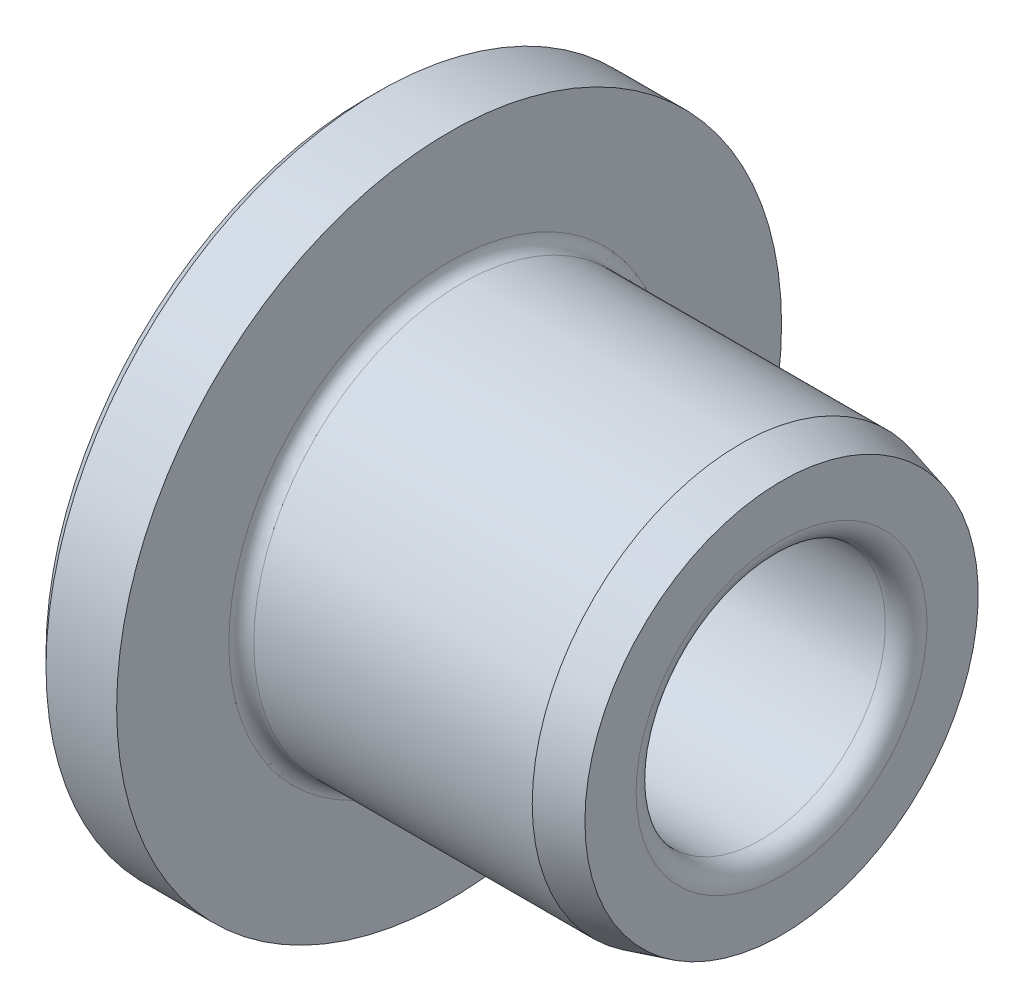
ISO-10303-21;
HEADER;
FILE_DESCRIPTION(('STEP AP214'),'2;1');
FILE_NAME('part.step','',(''),(''),'','','');
FILE_SCHEMA(('AUTOMOTIVE_DESIGN { 1 0 10303 214 1 1 1 1 }'));
ENDSEC;
DATA;
#1=APPLICATION_CONTEXT('core data for automotive mechanical design processes');
#2=APPLICATION_PROTOCOL_DEFINITION('international standard','automotive_design',2000,#1);
#3=PRODUCT_CONTEXT('',#1,'mechanical');
#4=PRODUCT('Part','Part','',(#3));
#5=PRODUCT_RELATED_PRODUCT_CATEGORY('part','',(#4));
#6=PRODUCT_DEFINITION_FORMATION('','',#4);
#7=PRODUCT_DEFINITION_CONTEXT('part definition',#1,'design');
#8=PRODUCT_DEFINITION('design','',#6,#7);
#9=PRODUCT_DEFINITION_SHAPE('','',#8);
#10=(LENGTH_UNIT() NAMED_UNIT(*) SI_UNIT(.MILLI.,.METRE.));
#11=(NAMED_UNIT(*) PLANE_ANGLE_UNIT() SI_UNIT($,.RADIAN.));
#12=(NAMED_UNIT(*) SI_UNIT($,.STERADIAN.) SOLID_ANGLE_UNIT());
#13=UNCERTAINTY_MEASURE_WITH_UNIT(LENGTH_MEASURE(1.E-05),#10,'distance_accuracy_value','');
#14=(GEOMETRIC_REPRESENTATION_CONTEXT(3) GLOBAL_UNCERTAINTY_ASSIGNED_CONTEXT((#13)) GLOBAL_UNIT_ASSIGNED_CONTEXT((#10,
#11,#12)) REPRESENTATION_CONTEXT('',''));
#15=CARTESIAN_POINT('',(0.,0.,0.));
#16=DIRECTION('',(0.,0.,1.));
#17=DIRECTION('',(1.,0.,0.));
#18=AXIS2_PLACEMENT_3D('',#15,#16,#17);
#19=CARTESIAN_POINT('',(-2.,8.,0.));
#20=DIRECTION('',(1.,0.,0.));
#21=DIRECTION('',(0.,0.,-1.));
#22=AXIS2_PLACEMENT_3D('',#19,#20,#21);
#23=PLANE('',#22);
#24=CARTESIAN_POINT('',(-2.,0.,0.));
#25=DIRECTION('',(1.,0.,0.));
#26=DIRECTION('',(0.,0.,-1.));
#27=AXIS2_PLACEMENT_3D('',#24,#25,#26);
#28=CIRCLE('',#27,3.5);
#29=CARTESIAN_POINT('',(-2.,0.,-3.5));
#30=VERTEX_POINT('',#29);
#31=EDGE_CURVE('E10',#30,#30,#28,.T.);
#32=ORIENTED_EDGE('',*,*,#31,.T.);
#33=EDGE_LOOP('',(#32));
#34=FACE_BOUND('',#33,.T.);
#35=CARTESIAN_POINT('',(-2.,0.,0.));
#36=DIRECTION('',(1.,0.,0.));
#37=DIRECTION('',(0.,0.,-1.));
#38=AXIS2_PLACEMENT_3D('',#35,#36,#37);
#39=CIRCLE('',#38,7.7);
#40=CARTESIAN_POINT('',(-2.,0.,-7.7));
#41=VERTEX_POINT('',#40);
#42=EDGE_CURVE('E66',#41,#41,#39,.F.);
#43=ORIENTED_EDGE('',*,*,#42,.T.);
#44=EDGE_LOOP('',(#43));
#45=FACE_BOUND('',#44,.T.);
#46=ADVANCED_FACE('F31',(#34,#45),#23,.F.);
#47=CARTESIAN_POINT('',(-2.,0.,0.));
#48=DIRECTION('',(-1.,0.,0.));
#49=DIRECTION('',(0.,0.,1.));
#50=AXIS2_PLACEMENT_3D('',#47,#48,#49);
#51=CYLINDRICAL_SURFACE('',#50,3.);
#52=CARTESIAN_POINT('',(7.5,0.,0.));
#53=DIRECTION('',(-1.,0.,0.));
#54=DIRECTION('',(0.,0.,1.));
#55=AXIS2_PLACEMENT_3D('',#52,#53,#54);
#56=CIRCLE('',#55,3.);
#57=CARTESIAN_POINT('',(7.5,0.,3.));
#58=VERTEX_POINT('',#57);
#59=EDGE_CURVE('E38',#58,#58,#56,.F.);
#60=ORIENTED_EDGE('',*,*,#59,.T.);
#61=EDGE_LOOP('',(#60));
#62=FACE_BOUND('',#61,.T.);
#63=CARTESIAN_POINT('',(-1.5,0.,0.));
#64=DIRECTION('',(1.,0.,0.));
#65=DIRECTION('',(0.,0.,-1.));
#66=AXIS2_PLACEMENT_3D('',#63,#64,#65);
#67=CIRCLE('',#66,3.);
#68=CARTESIAN_POINT('',(-1.5,0.,-3.));
#69=VERTEX_POINT('',#68);
#70=EDGE_CURVE('E42',#69,#69,#67,.F.);
#71=ORIENTED_EDGE('',*,*,#70,.T.);
#72=EDGE_LOOP('',(#71));
#73=FACE_BOUND('',#72,.T.);
#74=ADVANCED_FACE('F91',(#62,#73),#51,.F.);
#75=CARTESIAN_POINT('',(8.,3.,0.));
#76=DIRECTION('',(-1.,0.,0.));
#77=DIRECTION('',(0.,0.,1.));
#78=AXIS2_PLACEMENT_3D('',#75,#76,#77);
#79=PLANE('',#78);
#80=CARTESIAN_POINT('',(8.,0.,0.));
#81=DIRECTION('',(-1.,0.,0.));
#82=DIRECTION('',(0.,0.,1.));
#83=AXIS2_PLACEMENT_3D('',#80,#81,#82);
#84=CIRCLE('',#83,3.5);
#85=CARTESIAN_POINT('',(8.,0.,3.5));
#86=VERTEX_POINT('',#85);
#87=EDGE_CURVE('E46',#86,#86,#84,.T.);
#88=ORIENTED_EDGE('',*,*,#87,.T.);
#89=EDGE_LOOP('',(#88));
#90=FACE_BOUND('',#89,.T.);
#91=CARTESIAN_POINT('',(8.,0.,0.));
#92=DIRECTION('',(-1.,0.,0.));
#93=DIRECTION('',(0.,0.,1.));
#94=AXIS2_PLACEMENT_3D('',#91,#92,#93);
#95=CIRCLE('',#94,4.73205080756888);
#96=CARTESIAN_POINT('',(8.,0.,4.73205080756888));
#97=VERTEX_POINT('',#96);
#98=EDGE_CURVE('E51',#97,#97,#95,.F.);
#99=ORIENTED_EDGE('',*,*,#98,.T.);
#100=EDGE_LOOP('',(#99));
#101=FACE_BOUND('',#100,.T.);
#102=ADVANCED_FACE('F87',(#90,#101),#79,.F.);
#103=CARTESIAN_POINT('',(-2.,0.,0.));
#104=DIRECTION('',(-1.,0.,0.));
#105=DIRECTION('',(0.,0.,1.));
#106=AXIS2_PLACEMENT_3D('',#103,#104,#105);
#107=CYLINDRICAL_SURFACE('',#106,5.);
#108=CARTESIAN_POINT('',(7.00000000000001,0.,0.));
#109=DIRECTION('',(-1.,0.,0.));
#110=DIRECTION('',(0.,0.,1.));
#111=AXIS2_PLACEMENT_3D('',#108,#109,#110);
#112=CIRCLE('',#111,5.);
#113=CARTESIAN_POINT('',(7.00000000000001,0.,5.));
#114=VERTEX_POINT('',#113);
#115=EDGE_CURVE('E54',#114,#114,#112,.T.);
#116=ORIENTED_EDGE('',*,*,#115,.T.);
#117=EDGE_LOOP('',(#116));
#118=FACE_BOUND('',#117,.T.);
#119=CARTESIAN_POINT('',(0.3,0.,0.));
#120=DIRECTION('',(-1.,0.,0.));
#121=DIRECTION('',(0.,0.,1.));
#122=AXIS2_PLACEMENT_3D('',#119,#120,#121);
#123=CIRCLE('',#122,5.);
#124=CARTESIAN_POINT('',(0.3,0.,5.));
#125=VERTEX_POINT('',#124);
#126=EDGE_CURVE('E57',#125,#125,#123,.F.);
#127=ORIENTED_EDGE('',*,*,#126,.T.);
#128=EDGE_LOOP('',(#127));
#129=FACE_BOUND('',#128,.T.);
#130=ADVANCED_FACE('F77',(#118,#129),#107,.T.);
#131=CARTESIAN_POINT('',(0.,5.,0.));
#132=DIRECTION('',(-1.,0.,0.));
#133=DIRECTION('',(0.,0.,1.));
#134=AXIS2_PLACEMENT_3D('',#131,#132,#133);
#135=PLANE('',#134);
#136=CARTESIAN_POINT('',(0.,0.,0.));
#137=DIRECTION('',(-1.,0.,0.));
#138=DIRECTION('',(0.,0.,1.));
#139=AXIS2_PLACEMENT_3D('',#136,#137,#138);
#140=CIRCLE('',#139,5.3);
#141=CARTESIAN_POINT('',(0.,0.,5.3));
#142=VERTEX_POINT('',#141);
#143=EDGE_CURVE('E60',#142,#142,#140,.T.);
#144=ORIENTED_EDGE('',*,*,#143,.T.);
#145=EDGE_LOOP('',(#144));
#146=FACE_BOUND('',#145,.T.);
#147=CARTESIAN_POINT('',(0.,0.,0.));
#148=DIRECTION('',(-1.,0.,0.));
#149=DIRECTION('',(0.,0.,1.));
#150=AXIS2_PLACEMENT_3D('',#147,#148,#149);
#151=CIRCLE('',#150,8.);
#152=CARTESIAN_POINT('',(0.,0.,8.));
#153=VERTEX_POINT('',#152);
#154=EDGE_CURVE('E69',#153,#153,#151,.T.);
#155=ORIENTED_EDGE('',*,*,#154,.F.);
#156=EDGE_LOOP('',(#155));
#157=FACE_BOUND('',#156,.T.);
#158=ADVANCED_FACE('F75',(#146,#157),#135,.F.);
#159=CARTESIAN_POINT('',(-2.,0.,0.));
#160=DIRECTION('',(-1.,0.,0.));
#161=DIRECTION('',(0.,0.,1.));
#162=AXIS2_PLACEMENT_3D('',#159,#160,#161);
#163=CYLINDRICAL_SURFACE('',#162,8.);
#164=CARTESIAN_POINT('',(-1.7,0.,0.));
#165=DIRECTION('',(1.,0.,0.));
#166=DIRECTION('',(0.,0.,-1.));
#167=AXIS2_PLACEMENT_3D('',#164,#165,#166);
#168=CIRCLE('',#167,8.);
#169=CARTESIAN_POINT('',(-1.7,0.,-8.));
#170=VERTEX_POINT('',#169);
#171=EDGE_CURVE('E63',#170,#170,#168,.T.);
#172=ORIENTED_EDGE('',*,*,#171,.T.);
#173=EDGE_LOOP('',(#172));
#174=FACE_BOUND('',#173,.T.);
#175=ORIENTED_EDGE('',*,*,#154,.T.);
#176=EDGE_LOOP('',(#175));
#177=FACE_BOUND('',#176,.T.);
#178=ADVANCED_FACE('F73',(#174,#177),#163,.T.);
#179=CARTESIAN_POINT('',(-2.,0.,0.));
#180=DIRECTION('',(1.,0.,0.));
#181=DIRECTION('',(0.,0.,-1.));
#182=AXIS2_PLACEMENT_3D('',#179,#180,#181);
#183=CONICAL_SURFACE('',#182,7.7,0.785398163397445);
#184=ORIENTED_EDGE('',*,*,#171,.F.);
#185=EDGE_LOOP('',(#184));
#186=FACE_BOUND('',#185,.T.);
#187=ORIENTED_EDGE('',*,*,#42,.F.);
#188=EDGE_LOOP('',(#187));
#189=FACE_BOUND('',#188,.T.);
#190=ADVANCED_FACE('F84',(#186,#189),#183,.T.);
#191=CARTESIAN_POINT('',(0.3,0.,0.));
#192=DIRECTION('',(-1.,0.,0.));
#193=DIRECTION('',(0.,0.,1.));
#194=AXIS2_PLACEMENT_3D('',#191,#192,#193);
#195=TOROIDAL_SURFACE('',#194,5.3,0.3);
#196=ORIENTED_EDGE('',*,*,#126,.F.);
#197=EDGE_LOOP('',(#196));
#198=FACE_BOUND('',#197,.T.);
#199=ORIENTED_EDGE('',*,*,#143,.F.);
#200=EDGE_LOOP('',(#199));
#201=FACE_BOUND('',#200,.T.);
#202=ADVANCED_FACE('F102',(#198,#201),#195,.F.);
#203=CARTESIAN_POINT('',(7.00000000000001,0.,0.));
#204=DIRECTION('',(-1.,0.,0.));
#205=DIRECTION('',(0.,0.,1.));
#206=AXIS2_PLACEMENT_3D('',#203,#204,#205);
#207=CONICAL_SURFACE('',#206,5.,0.261799387799146);
#208=ORIENTED_EDGE('',*,*,#98,.F.);
#209=EDGE_LOOP('',(#208));
#210=FACE_BOUND('',#209,.T.);
#211=ORIENTED_EDGE('',*,*,#115,.F.);
#212=EDGE_LOOP('',(#211));
#213=FACE_BOUND('',#212,.T.);
#214=ADVANCED_FACE('F106',(#210,#213),#207,.T.);
#215=CARTESIAN_POINT('',(7.5,0.,0.));
#216=DIRECTION('',(-1.,0.,0.));
#217=DIRECTION('',(0.,0.,1.));
#218=AXIS2_PLACEMENT_3D('',#215,#216,#217);
#219=TOROIDAL_SURFACE('',#218,3.5,0.5);
#220=ORIENTED_EDGE('',*,*,#59,.F.);
#221=EDGE_LOOP('',(#220));
#222=FACE_BOUND('',#221,.T.);
#223=ORIENTED_EDGE('',*,*,#87,.F.);
#224=EDGE_LOOP('',(#223));
#225=FACE_BOUND('',#224,.T.);
#226=ADVANCED_FACE('F109',(#222,#225),#219,.T.);
#227=CARTESIAN_POINT('',(-1.5,0.,0.));
#228=DIRECTION('',(1.,0.,0.));
#229=DIRECTION('',(0.,0.,-1.));
#230=AXIS2_PLACEMENT_3D('',#227,#228,#229);
#231=TOROIDAL_SURFACE('',#230,3.5,0.5);
#232=ORIENTED_EDGE('',*,*,#31,.F.);
#233=EDGE_LOOP('',(#232));
#234=FACE_BOUND('',#233,.T.);
#235=ORIENTED_EDGE('',*,*,#70,.F.);
#236=EDGE_LOOP('',(#235));
#237=FACE_BOUND('',#236,.T.);
#238=ADVANCED_FACE('F33',(#234,#237),#231,.T.);
#239=CLOSED_SHELL('',(#46,#74,#102,#130,#158,#178,#190,#202,#214,#226,#238));
#240=MANIFOLD_SOLID_BREP('B2',#239);
#241=ADVANCED_BREP_SHAPE_REPRESENTATION('',(#18,#240),#14);
#242=SHAPE_DEFINITION_REPRESENTATION(#9,#241);
ENDSEC;
END-ISO-10303-21;
